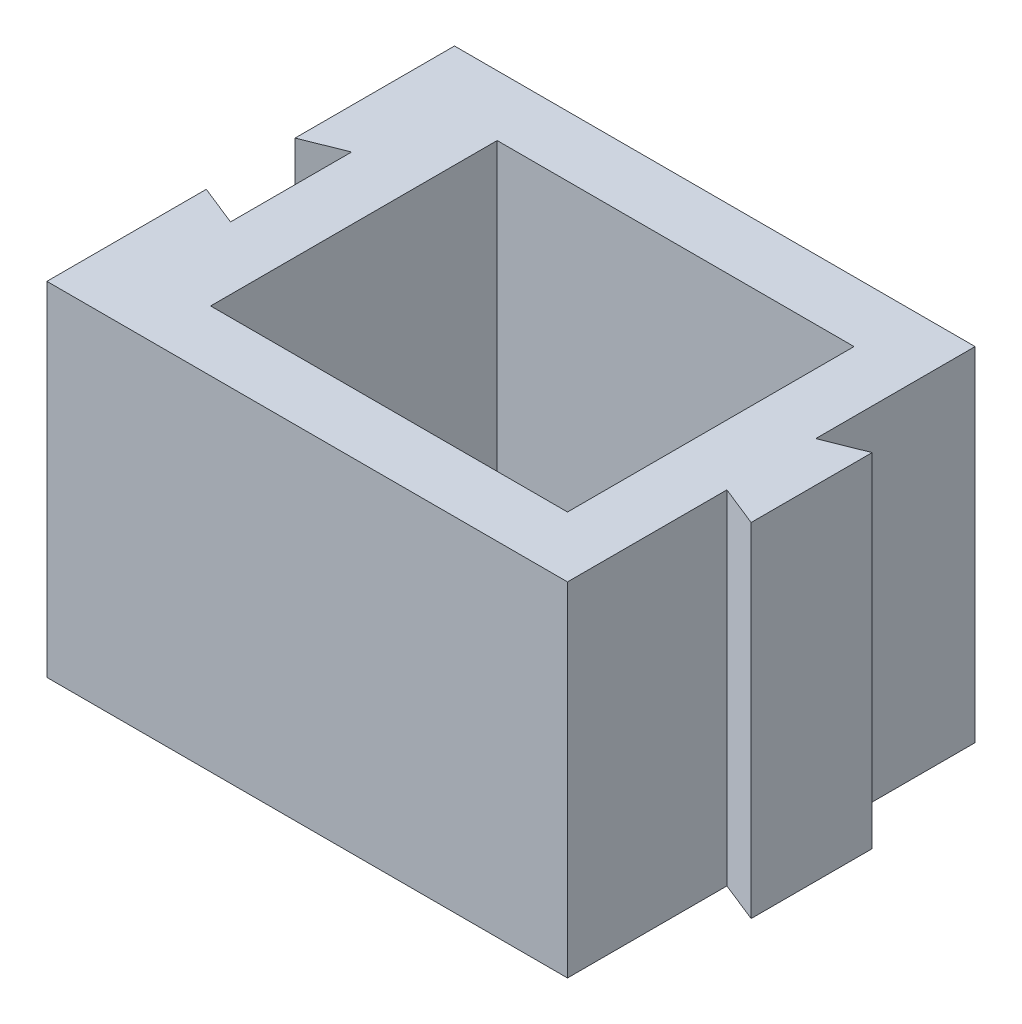
ISO-10303-21;
HEADER;
FILE_DESCRIPTION(('STEP AP214'),'2;1');
FILE_NAME('part.step','',(''),(''),'','','');
FILE_SCHEMA(('AUTOMOTIVE_DESIGN { 1 0 10303 214 1 1 1 1 }'));
ENDSEC;
DATA;
#1=APPLICATION_CONTEXT('core data for automotive mechanical design processes');
#2=APPLICATION_PROTOCOL_DEFINITION('international standard','automotive_design',2000,#1);
#3=PRODUCT_CONTEXT('',#1,'mechanical');
#4=PRODUCT('Part','Part','',(#3));
#5=PRODUCT_RELATED_PRODUCT_CATEGORY('part','',(#4));
#6=PRODUCT_DEFINITION_FORMATION('','',#4);
#7=PRODUCT_DEFINITION_CONTEXT('part definition',#1,'design');
#8=PRODUCT_DEFINITION('design','',#6,#7);
#9=PRODUCT_DEFINITION_SHAPE('','',#8);
#10=(LENGTH_UNIT() NAMED_UNIT(*) SI_UNIT(.MILLI.,.METRE.));
#11=(NAMED_UNIT(*) PLANE_ANGLE_UNIT() SI_UNIT($,.RADIAN.));
#12=(NAMED_UNIT(*) SI_UNIT($,.STERADIAN.) SOLID_ANGLE_UNIT());
#13=UNCERTAINTY_MEASURE_WITH_UNIT(LENGTH_MEASURE(1.E-05),#10,'distance_accuracy_value','');
#14=(GEOMETRIC_REPRESENTATION_CONTEXT(3) GLOBAL_UNCERTAINTY_ASSIGNED_CONTEXT((#13)) GLOBAL_UNIT_ASSIGNED_CONTEXT((#10,
#11,#12)) REPRESENTATION_CONTEXT('',''));
#15=CARTESIAN_POINT('',(0.,0.,0.));
#16=DIRECTION('',(0.,0.,1.));
#17=DIRECTION('',(1.,0.,0.));
#18=AXIS2_PLACEMENT_3D('',#15,#16,#17);
#19=CARTESIAN_POINT('',(-27.25,42.5,0.));
#20=DIRECTION('',(1.,0.,0.));
#21=DIRECTION('',(0.,0.,-1.));
#22=AXIS2_PLACEMENT_3D('',#19,#20,#21);
#23=PLANE('',#22);
#24=DIRECTION('',(0.,0.,1.));
#25=VECTOR('',#24,1.);
#26=CARTESIAN_POINT('',(-27.25,0.,0.));
#27=LINE('',#26,#25);
#28=CARTESIAN_POINT('',(-27.25,0.,-7.50000000000002));
#29=VERTEX_POINT('',#28);
#30=CARTESIAN_POINT('',(-27.25,0.,7.49999999999998));
#31=VERTEX_POINT('',#30);
#32=EDGE_CURVE('E185',#29,#31,#27,.T.);
#33=ORIENTED_EDGE('',*,*,#32,.T.);
#34=DIRECTION('',(0.,-1.,0.));
#35=VECTOR('',#34,1.);
#36=CARTESIAN_POINT('',(-27.25,42.5,7.49999999999998));
#37=LINE('',#36,#35);
#38=CARTESIAN_POINT('',(-27.25,42.5,7.49999999999998));
#39=VERTEX_POINT('',#38);
#40=EDGE_CURVE('E11',#39,#31,#37,.T.);
#41=ORIENTED_EDGE('',*,*,#40,.F.);
#42=DIRECTION('',(0.,0.,1.));
#43=VECTOR('',#42,1.);
#44=CARTESIAN_POINT('',(-27.25,42.5,0.));
#45=LINE('',#44,#43);
#46=CARTESIAN_POINT('',(-27.25,42.5,-7.50000000000002));
#47=VERTEX_POINT('',#46);
#48=EDGE_CURVE('E187',#47,#39,#45,.T.);
#49=ORIENTED_EDGE('',*,*,#48,.F.);
#50=DIRECTION('',(0.,-1.,0.));
#51=VECTOR('',#50,1.);
#52=CARTESIAN_POINT('',(-27.25,42.5,-7.50000000000002));
#53=LINE('',#52,#51);
#54=EDGE_CURVE('E216',#47,#29,#53,.T.);
#55=ORIENTED_EDGE('',*,*,#54,.T.);
#56=EDGE_LOOP('',(#33,#41,#49,#55));
#57=FACE_BOUND('',#56,.T.);
#58=ADVANCED_FACE('F43',(#57),#23,.F.);
#59=CARTESIAN_POINT('',(-6.344827586207,42.5,15.8620689655173));
#60=DIRECTION('',(-0.371390676354108,0.,0.928476690885258));
#61=DIRECTION('',(0.928476690885258,0.,0.371390676354108));
#62=AXIS2_PLACEMENT_3D('',#59,#60,#61);
#63=PLANE('',#62);
#64=DIRECTION('',(-0.928476690885258,0.,-0.371390676354108));
#65=VECTOR('',#64,1.);
#66=CARTESIAN_POINT('',(-6.344827586207,0.,15.8620689655173));
#67=LINE('',#66,#65);
#68=CARTESIAN_POINT('',(-32.25,0.,5.49999999999996));
#69=VERTEX_POINT('',#68);
#70=EDGE_CURVE('E219',#31,#69,#67,.T.);
#71=ORIENTED_EDGE('',*,*,#70,.T.);
#72=DIRECTION('',(0.,-1.,0.));
#73=VECTOR('',#72,1.);
#74=CARTESIAN_POINT('',(-32.25,42.5,5.49999999999996));
#75=LINE('',#74,#73);
#76=CARTESIAN_POINT('',(-32.25,42.5,5.49999999999996));
#77=VERTEX_POINT('',#76);
#78=EDGE_CURVE('E50',#77,#69,#75,.T.);
#79=ORIENTED_EDGE('',*,*,#78,.F.);
#80=DIRECTION('',(-0.928476690885258,0.,-0.371390676354108));
#81=VECTOR('',#80,1.);
#82=CARTESIAN_POINT('',(-6.344827586207,42.5,15.8620689655173));
#83=LINE('',#82,#81);
#84=EDGE_CURVE('E190',#39,#77,#83,.T.);
#85=ORIENTED_EDGE('',*,*,#84,.F.);
#86=ORIENTED_EDGE('',*,*,#40,.T.);
#87=EDGE_LOOP('',(#71,#79,#85,#86));
#88=FACE_BOUND('',#87,.T.);
#89=ADVANCED_FACE('F286',(#88),#63,.F.);
#90=CARTESIAN_POINT('',(-32.25,42.5,0.));
#91=DIRECTION('',(1.,0.,0.));
#92=DIRECTION('',(0.,0.,-1.));
#93=AXIS2_PLACEMENT_3D('',#90,#91,#92);
#94=PLANE('',#93);
#95=DIRECTION('',(0.,0.,1.));
#96=VECTOR('',#95,1.);
#97=CARTESIAN_POINT('',(-32.25,0.,0.));
#98=LINE('',#97,#96);
#99=CARTESIAN_POINT('',(-32.25,0.,25.25));
#100=VERTEX_POINT('',#99);
#101=EDGE_CURVE('E221',#69,#100,#98,.T.);
#102=ORIENTED_EDGE('',*,*,#101,.T.);
#103=DIRECTION('',(0.,-1.,0.));
#104=VECTOR('',#103,1.);
#105=CARTESIAN_POINT('',(-32.25,42.5,25.25));
#106=LINE('',#105,#104);
#107=CARTESIAN_POINT('',(-32.25,42.5,25.25));
#108=VERTEX_POINT('',#107);
#109=EDGE_CURVE('E263',#108,#100,#106,.T.);
#110=ORIENTED_EDGE('',*,*,#109,.F.);
#111=DIRECTION('',(0.,0.,1.));
#112=VECTOR('',#111,1.);
#113=CARTESIAN_POINT('',(-32.25,42.5,0.));
#114=LINE('',#113,#112);
#115=EDGE_CURVE('E193',#77,#108,#114,.T.);
#116=ORIENTED_EDGE('',*,*,#115,.F.);
#117=ORIENTED_EDGE('',*,*,#78,.T.);
#118=EDGE_LOOP('',(#102,#110,#116,#117));
#119=FACE_BOUND('',#118,.T.);
#120=ADVANCED_FACE('F270',(#119),#94,.F.);
#121=CARTESIAN_POINT('',(0.,42.5,25.25));
#122=DIRECTION('',(0.,0.,-1.));
#123=DIRECTION('',(-1.,0.,0.));
#124=AXIS2_PLACEMENT_3D('',#121,#122,#123);
#125=PLANE('',#124);
#126=DIRECTION('',(1.,0.,0.));
#127=VECTOR('',#126,1.);
#128=CARTESIAN_POINT('',(0.,0.,25.25));
#129=LINE('',#128,#127);
#130=CARTESIAN_POINT('',(32.25,0.,25.25));
#131=VERTEX_POINT('',#130);
#132=EDGE_CURVE('E223',#100,#131,#129,.T.);
#133=ORIENTED_EDGE('',*,*,#132,.T.);
#134=DIRECTION('',(0.,-1.,0.));
#135=VECTOR('',#134,1.);
#136=CARTESIAN_POINT('',(32.25,42.5,25.25));
#137=LINE('',#136,#135);
#138=CARTESIAN_POINT('',(32.25,42.5,25.25));
#139=VERTEX_POINT('',#138);
#140=EDGE_CURVE('E261',#139,#131,#137,.T.);
#141=ORIENTED_EDGE('',*,*,#140,.F.);
#142=DIRECTION('',(1.,0.,0.));
#143=VECTOR('',#142,1.);
#144=CARTESIAN_POINT('',(0.,42.5,25.25));
#145=LINE('',#144,#143);
#146=EDGE_CURVE('E195',#108,#139,#145,.T.);
#147=ORIENTED_EDGE('',*,*,#146,.F.);
#148=ORIENTED_EDGE('',*,*,#109,.T.);
#149=EDGE_LOOP('',(#133,#141,#147,#148));
#150=FACE_BOUND('',#149,.T.);
#151=ADVANCED_FACE('F280',(#150),#125,.F.);
#152=CARTESIAN_POINT('',(32.25,42.5,0.));
#153=DIRECTION('',(1.,0.,0.));
#154=DIRECTION('',(0.,0.,-1.));
#155=AXIS2_PLACEMENT_3D('',#152,#153,#154);
#156=PLANE('',#155);
#157=DIRECTION('',(0.,0.,1.));
#158=VECTOR('',#157,1.);
#159=CARTESIAN_POINT('',(32.25,0.,0.));
#160=LINE('',#159,#158);
#161=CARTESIAN_POINT('',(32.25,0.,5.49999999999997));
#162=VERTEX_POINT('',#161);
#163=EDGE_CURVE('E227',#162,#131,#160,.T.);
#164=ORIENTED_EDGE('',*,*,#163,.F.);
#165=DIRECTION('',(0.,-1.,0.));
#166=VECTOR('',#165,1.);
#167=CARTESIAN_POINT('',(32.25,42.5,5.49999999999997));
#168=LINE('',#167,#166);
#169=CARTESIAN_POINT('',(32.25,42.5,5.49999999999997));
#170=VERTEX_POINT('',#169);
#171=EDGE_CURVE('E259',#170,#162,#168,.T.);
#172=ORIENTED_EDGE('',*,*,#171,.F.);
#173=DIRECTION('',(0.,0.,1.));
#174=VECTOR('',#173,1.);
#175=CARTESIAN_POINT('',(32.25,42.5,0.));
#176=LINE('',#175,#174);
#177=EDGE_CURVE('E198',#170,#139,#176,.T.);
#178=ORIENTED_EDGE('',*,*,#177,.T.);
#179=ORIENTED_EDGE('',*,*,#140,.T.);
#180=EDGE_LOOP('',(#164,#172,#178,#179));
#181=FACE_BOUND('',#180,.T.);
#182=ADVANCED_FACE('F320',(#181),#156,.T.);
#183=CARTESIAN_POINT('',(2.55172413793113,42.5,-6.37931034482775));
#184=DIRECTION('',(-0.371390676354108,0.,0.928476690885258));
#185=DIRECTION('',(0.928476690885258,0.,0.371390676354108));
#186=AXIS2_PLACEMENT_3D('',#183,#184,#185);
#187=PLANE('',#186);
#188=DIRECTION('',(-0.928476690885258,0.,-0.371390676354108));
#189=VECTOR('',#188,1.);
#190=CARTESIAN_POINT('',(2.55172413793113,0.,-6.37931034482775));
#191=LINE('',#190,#189);
#192=CARTESIAN_POINT('',(37.25,0.,7.49999999999999));
#193=VERTEX_POINT('',#192);
#194=EDGE_CURVE('E230',#193,#162,#191,.T.);
#195=ORIENTED_EDGE('',*,*,#194,.F.);
#196=DIRECTION('',(0.,-1.,0.));
#197=VECTOR('',#196,1.);
#198=CARTESIAN_POINT('',(37.25,42.5,7.49999999999999));
#199=LINE('',#198,#197);
#200=CARTESIAN_POINT('',(37.25,42.5,7.49999999999999));
#201=VERTEX_POINT('',#200);
#202=EDGE_CURVE('E257',#201,#193,#199,.T.);
#203=ORIENTED_EDGE('',*,*,#202,.F.);
#204=DIRECTION('',(-0.928476690885258,0.,-0.371390676354108));
#205=VECTOR('',#204,1.);
#206=CARTESIAN_POINT('',(2.55172413793113,42.5,-6.37931034482775));
#207=LINE('',#206,#205);
#208=EDGE_CURVE('E201',#201,#170,#207,.T.);
#209=ORIENTED_EDGE('',*,*,#208,.T.);
#210=ORIENTED_EDGE('',*,*,#171,.T.);
#211=EDGE_LOOP('',(#195,#203,#209,#210));
#212=FACE_BOUND('',#211,.T.);
#213=ADVANCED_FACE('F318',(#212),#187,.T.);
#214=CARTESIAN_POINT('',(37.25,42.5,0.));
#215=DIRECTION('',(1.,0.,0.));
#216=DIRECTION('',(0.,0.,-1.));
#217=AXIS2_PLACEMENT_3D('',#214,#215,#216);
#218=PLANE('',#217);
#219=DIRECTION('',(0.,0.,1.));
#220=VECTOR('',#219,1.);
#221=CARTESIAN_POINT('',(37.25,0.,0.));
#222=LINE('',#221,#220);
#223=CARTESIAN_POINT('',(37.25,0.,-7.50000000000001));
#224=VERTEX_POINT('',#223);
#225=EDGE_CURVE('E234',#224,#193,#222,.T.);
#226=ORIENTED_EDGE('',*,*,#225,.F.);
#227=DIRECTION('',(0.,-1.,0.));
#228=VECTOR('',#227,1.);
#229=CARTESIAN_POINT('',(37.25,42.5,-7.50000000000001));
#230=LINE('',#229,#228);
#231=CARTESIAN_POINT('',(37.25,42.5,-7.50000000000001));
#232=VERTEX_POINT('',#231);
#233=EDGE_CURVE('E255',#232,#224,#230,.T.);
#234=ORIENTED_EDGE('',*,*,#233,.F.);
#235=DIRECTION('',(0.,0.,1.));
#236=VECTOR('',#235,1.);
#237=CARTESIAN_POINT('',(37.25,42.5,0.));
#238=LINE('',#237,#236);
#239=EDGE_CURVE('E205',#232,#201,#238,.T.);
#240=ORIENTED_EDGE('',*,*,#239,.T.);
#241=ORIENTED_EDGE('',*,*,#202,.T.);
#242=EDGE_LOOP('',(#226,#234,#240,#241));
#243=FACE_BOUND('',#242,.T.);
#244=ADVANCED_FACE('F315',(#243),#218,.T.);
#245=CARTESIAN_POINT('',(2.55172413793105,42.5,6.37931034482761));
#246=DIRECTION('',(-0.371390676354105,0.,-0.928476690885259));
#247=DIRECTION('',(-0.928476690885259,0.,0.371390676354105));
#248=AXIS2_PLACEMENT_3D('',#245,#246,#247);
#249=PLANE('',#248);
#250=DIRECTION('',(0.928476690885259,0.,-0.371390676354105));
#251=VECTOR('',#250,1.);
#252=CARTESIAN_POINT('',(2.55172413793105,0.,6.37931034482761));
#253=LINE('',#252,#251);
#254=CARTESIAN_POINT('',(32.25,0.,-5.50000000000001));
#255=VERTEX_POINT('',#254);
#256=EDGE_CURVE('E237',#255,#224,#253,.T.);
#257=ORIENTED_EDGE('',*,*,#256,.F.);
#258=DIRECTION('',(0.,-1.,0.));
#259=VECTOR('',#258,1.);
#260=CARTESIAN_POINT('',(32.25,42.5,-5.50000000000001));
#261=LINE('',#260,#259);
#262=CARTESIAN_POINT('',(32.25,42.5,-5.50000000000001));
#263=VERTEX_POINT('',#262);
#264=EDGE_CURVE('E253',#263,#255,#261,.T.);
#265=ORIENTED_EDGE('',*,*,#264,.F.);
#266=DIRECTION('',(0.928476690885259,0.,-0.371390676354105));
#267=VECTOR('',#266,1.);
#268=CARTESIAN_POINT('',(2.55172413793105,42.5,6.37931034482761));
#269=LINE('',#268,#267);
#270=EDGE_CURVE('E208',#263,#232,#269,.T.);
#271=ORIENTED_EDGE('',*,*,#270,.T.);
#272=ORIENTED_EDGE('',*,*,#233,.T.);
#273=EDGE_LOOP('',(#257,#265,#271,#272));
#274=FACE_BOUND('',#273,.T.);
#275=ADVANCED_FACE('F311',(#274),#249,.T.);
#276=CARTESIAN_POINT('',(32.25,0.,-25.25));
#277=VERTEX_POINT('',#276);
#278=EDGE_CURVE('E231',#277,#255,#160,.T.);
#279=ORIENTED_EDGE('',*,*,#278,.F.);
#280=DIRECTION('',(0.,-1.,0.));
#281=VECTOR('',#280,1.);
#282=CARTESIAN_POINT('',(32.25,42.5,-25.25));
#283=LINE('',#282,#281);
#284=CARTESIAN_POINT('',(32.25,42.5,-25.25));
#285=VERTEX_POINT('',#284);
#286=EDGE_CURVE('E251',#285,#277,#283,.T.);
#287=ORIENTED_EDGE('',*,*,#286,.F.);
#288=EDGE_CURVE('E202',#285,#263,#176,.T.);
#289=ORIENTED_EDGE('',*,*,#288,.T.);
#290=ORIENTED_EDGE('',*,*,#264,.T.);
#291=EDGE_LOOP('',(#279,#287,#289,#290));
#292=FACE_BOUND('',#291,.T.);
#293=ADVANCED_FACE('F306',(#292),#156,.T.);
#294=CARTESIAN_POINT('',(0.,42.5,-25.25));
#295=DIRECTION('',(0.,0.,-1.));
#296=DIRECTION('',(-1.,0.,0.));
#297=AXIS2_PLACEMENT_3D('',#294,#295,#296);
#298=PLANE('',#297);
#299=DIRECTION('',(1.,0.,0.));
#300=VECTOR('',#299,1.);
#301=CARTESIAN_POINT('',(0.,0.,-25.25));
#302=LINE('',#301,#300);
#303=CARTESIAN_POINT('',(-32.25,0.,-25.25));
#304=VERTEX_POINT('',#303);
#305=EDGE_CURVE('E240',#304,#277,#302,.T.);
#306=ORIENTED_EDGE('',*,*,#305,.F.);
#307=DIRECTION('',(0.,-1.,0.));
#308=VECTOR('',#307,1.);
#309=CARTESIAN_POINT('',(-32.25,42.5,-25.25));
#310=LINE('',#309,#308);
#311=CARTESIAN_POINT('',(-32.25,42.5,-25.25));
#312=VERTEX_POINT('',#311);
#313=EDGE_CURVE('E249',#312,#304,#310,.T.);
#314=ORIENTED_EDGE('',*,*,#313,.F.);
#315=DIRECTION('',(1.,0.,0.));
#316=VECTOR('',#315,1.);
#317=CARTESIAN_POINT('',(0.,42.5,-25.25));
#318=LINE('',#317,#316);
#319=EDGE_CURVE('E211',#312,#285,#318,.T.);
#320=ORIENTED_EDGE('',*,*,#319,.T.);
#321=ORIENTED_EDGE('',*,*,#286,.T.);
#322=EDGE_LOOP('',(#306,#314,#320,#321));
#323=FACE_BOUND('',#322,.T.);
#324=ADVANCED_FACE('F301',(#323),#298,.T.);
#325=CARTESIAN_POINT('',(-32.25,0.,-5.50000000000002));
#326=VERTEX_POINT('',#325);
#327=EDGE_CURVE('E224',#304,#326,#98,.T.);
#328=ORIENTED_EDGE('',*,*,#327,.T.);
#329=DIRECTION('',(0.,-1.,0.));
#330=VECTOR('',#329,1.);
#331=CARTESIAN_POINT('',(-32.25,42.5,-5.50000000000002));
#332=LINE('',#331,#330);
#333=CARTESIAN_POINT('',(-32.25,42.5,-5.50000000000002));
#334=VERTEX_POINT('',#333);
#335=EDGE_CURVE('E246',#334,#326,#332,.T.);
#336=ORIENTED_EDGE('',*,*,#335,.F.);
#337=EDGE_CURVE('E196',#312,#334,#114,.T.);
#338=ORIENTED_EDGE('',*,*,#337,.F.);
#339=ORIENTED_EDGE('',*,*,#313,.T.);
#340=EDGE_LOOP('',(#328,#336,#338,#339));
#341=FACE_BOUND('',#340,.T.);
#342=ADVANCED_FACE('F298',(#341),#94,.F.);
#343=CARTESIAN_POINT('',(-6.34482758620693,42.5,-15.8620689655173));
#344=DIRECTION('',(-0.371390676354105,0.,-0.928476690885259));
#345=DIRECTION('',(-0.928476690885259,0.,0.371390676354105));
#346=AXIS2_PLACEMENT_3D('',#343,#344,#345);
#347=PLANE('',#346);
#348=DIRECTION('',(0.928476690885259,0.,-0.371390676354105));
#349=VECTOR('',#348,1.);
#350=CARTESIAN_POINT('',(-6.34482758620693,0.,-15.8620689655173));
#351=LINE('',#350,#349);
#352=EDGE_CURVE('E191',#326,#29,#351,.T.);
#353=ORIENTED_EDGE('',*,*,#352,.T.);
#354=ORIENTED_EDGE('',*,*,#54,.F.);
#355=DIRECTION('',(0.928476690885259,0.,-0.371390676354105));
#356=VECTOR('',#355,1.);
#357=CARTESIAN_POINT('',(-6.34482758620693,42.5,-15.8620689655173));
#358=LINE('',#357,#356);
#359=EDGE_CURVE('E214',#334,#47,#358,.T.);
#360=ORIENTED_EDGE('',*,*,#359,.F.);
#361=ORIENTED_EDGE('',*,*,#335,.T.);
#362=EDGE_LOOP('',(#353,#354,#360,#361));
#363=FACE_BOUND('',#362,.T.);
#364=ADVANCED_FACE('F293',(#363),#347,.F.);
#365=CARTESIAN_POINT('',(0.,42.5,0.));
#366=DIRECTION('',(0.,1.,0.));
#367=DIRECTION('',(0.,0.,1.));
#368=AXIS2_PLACEMENT_3D('',#365,#366,#367);
#369=PLANE('',#368);
#370=DIRECTION('',(1.,0.,0.));
#371=VECTOR('',#370,1.);
#372=CARTESIAN_POINT('',(24.75,42.5,17.75));
#373=LINE('',#372,#371);
#374=CARTESIAN_POINT('',(-19.4647021136519,42.5,17.75));
#375=VERTEX_POINT('',#374);
#376=CARTESIAN_POINT('',(24.75,42.5,17.75));
#377=VERTEX_POINT('',#376);
#378=EDGE_CURVE('E57',#375,#377,#373,.T.);
#379=ORIENTED_EDGE('',*,*,#378,.F.);
#380=DIRECTION('',(0.,0.,1.));
#381=VECTOR('',#380,1.);
#382=CARTESIAN_POINT('',(-19.4647021136519,42.5,17.75));
#383=LINE('',#382,#381);
#384=CARTESIAN_POINT('',(-19.4647021136519,42.5,-17.75));
#385=VERTEX_POINT('',#384);
#386=EDGE_CURVE('E174',#385,#375,#383,.T.);
#387=ORIENTED_EDGE('',*,*,#386,.F.);
#388=DIRECTION('',(-1.,0.,0.));
#389=VECTOR('',#388,1.);
#390=CARTESIAN_POINT('',(-19.4647021136519,42.5,-17.75));
#391=LINE('',#390,#389);
#392=CARTESIAN_POINT('',(24.75,42.5,-17.75));
#393=VERTEX_POINT('',#392);
#394=EDGE_CURVE('E158',#393,#385,#391,.T.);
#395=ORIENTED_EDGE('',*,*,#394,.F.);
#396=DIRECTION('',(0.,0.,-1.));
#397=VECTOR('',#396,1.);
#398=CARTESIAN_POINT('',(24.75,42.5,-17.75));
#399=LINE('',#398,#397);
#400=EDGE_CURVE('E167',#377,#393,#399,.T.);
#401=ORIENTED_EDGE('',*,*,#400,.F.);
#402=EDGE_LOOP('',(#379,#387,#395,#401));
#403=FACE_BOUND('',#402,.T.);
#404=ORIENTED_EDGE('',*,*,#48,.T.);
#405=ORIENTED_EDGE('',*,*,#84,.T.);
#406=ORIENTED_EDGE('',*,*,#115,.T.);
#407=ORIENTED_EDGE('',*,*,#146,.T.);
#408=ORIENTED_EDGE('',*,*,#177,.F.);
#409=ORIENTED_EDGE('',*,*,#208,.F.);
#410=ORIENTED_EDGE('',*,*,#239,.F.);
#411=ORIENTED_EDGE('',*,*,#270,.F.);
#412=ORIENTED_EDGE('',*,*,#288,.F.);
#413=ORIENTED_EDGE('',*,*,#319,.F.);
#414=ORIENTED_EDGE('',*,*,#337,.T.);
#415=ORIENTED_EDGE('',*,*,#359,.T.);
#416=EDGE_LOOP('',(#404,#405,#406,#407,#408,#409,#410,#411,#412,#413,#414,#415));
#417=FACE_BOUND('',#416,.T.);
#418=ADVANCED_FACE('F171',(#403,#417),#369,.T.);
#419=CARTESIAN_POINT('',(0.,0.,0.));
#420=DIRECTION('',(0.,1.,0.));
#421=DIRECTION('',(0.,0.,1.));
#422=AXIS2_PLACEMENT_3D('',#419,#420,#421);
#423=PLANE('',#422);
#424=DIRECTION('',(0.,0.,-1.));
#425=VECTOR('',#424,1.);
#426=CARTESIAN_POINT('',(-19.4647021136519,0.,17.75));
#427=LINE('',#426,#425);
#428=CARTESIAN_POINT('',(-19.4647021136519,0.,17.75));
#429=VERTEX_POINT('',#428);
#430=CARTESIAN_POINT('',(-19.4647021136519,0.,-17.75));
#431=VERTEX_POINT('',#430);
#432=EDGE_CURVE('E479',#429,#431,#427,.T.);
#433=ORIENTED_EDGE('',*,*,#432,.F.);
#434=DIRECTION('',(-1.,0.,0.));
#435=VECTOR('',#434,1.);
#436=CARTESIAN_POINT('',(24.75,0.,17.75));
#437=LINE('',#436,#435);
#438=CARTESIAN_POINT('',(24.75,0.,17.75));
#439=VERTEX_POINT('',#438);
#440=EDGE_CURVE('E186',#439,#429,#437,.T.);
#441=ORIENTED_EDGE('',*,*,#440,.F.);
#442=DIRECTION('',(0.,0.,1.));
#443=VECTOR('',#442,1.);
#444=CARTESIAN_POINT('',(24.75,0.,-17.75));
#445=LINE('',#444,#443);
#446=CARTESIAN_POINT('',(24.75,0.,-17.75));
#447=VERTEX_POINT('',#446);
#448=EDGE_CURVE('E183',#447,#439,#445,.T.);
#449=ORIENTED_EDGE('',*,*,#448,.F.);
#450=DIRECTION('',(1.,0.,0.));
#451=VECTOR('',#450,1.);
#452=CARTESIAN_POINT('',(-19.4647021136519,0.,-17.75));
#453=LINE('',#452,#451);
#454=EDGE_CURVE('E161',#431,#447,#453,.T.);
#455=ORIENTED_EDGE('',*,*,#454,.F.);
#456=EDGE_LOOP('',(#433,#441,#449,#455));
#457=FACE_BOUND('',#456,.T.);
#458=ORIENTED_EDGE('',*,*,#32,.F.);
#459=ORIENTED_EDGE('',*,*,#352,.F.);
#460=ORIENTED_EDGE('',*,*,#327,.F.);
#461=ORIENTED_EDGE('',*,*,#305,.T.);
#462=ORIENTED_EDGE('',*,*,#278,.T.);
#463=ORIENTED_EDGE('',*,*,#256,.T.);
#464=ORIENTED_EDGE('',*,*,#225,.T.);
#465=ORIENTED_EDGE('',*,*,#194,.T.);
#466=ORIENTED_EDGE('',*,*,#163,.T.);
#467=ORIENTED_EDGE('',*,*,#132,.F.);
#468=ORIENTED_EDGE('',*,*,#101,.F.);
#469=ORIENTED_EDGE('',*,*,#70,.F.);
#470=EDGE_LOOP('',(#458,#459,#460,#461,#462,#463,#464,#465,#466,#467,#468,#469));
#471=FACE_BOUND('',#470,.T.);
#472=ADVANCED_FACE('F276',(#457,#471),#423,.F.);
#473=CARTESIAN_POINT('',(24.75,-56.7026444092247,17.75));
#474=DIRECTION('',(0.,0.,1.));
#475=DIRECTION('',(1.,0.,0.));
#476=AXIS2_PLACEMENT_3D('',#473,#474,#475);
#477=PLANE('',#476);
#478=ORIENTED_EDGE('',*,*,#440,.T.);
#479=DIRECTION('',(0.,1.,0.));
#480=VECTOR('',#479,1.);
#481=CARTESIAN_POINT('',(-19.4647021136519,-56.7026444092247,17.75));
#482=LINE('',#481,#480);
#483=EDGE_CURVE('E179',#429,#375,#482,.T.);
#484=ORIENTED_EDGE('',*,*,#483,.T.);
#485=ORIENTED_EDGE('',*,*,#378,.T.);
#486=DIRECTION('',(0.,1.,0.));
#487=VECTOR('',#486,1.);
#488=CARTESIAN_POINT('',(24.75,-56.7026444092247,17.75));
#489=LINE('',#488,#487);
#490=EDGE_CURVE('E164',#439,#377,#489,.T.);
#491=ORIENTED_EDGE('',*,*,#490,.F.);
#492=EDGE_LOOP('',(#478,#484,#485,#491));
#493=FACE_BOUND('',#492,.T.);
#494=ADVANCED_FACE('F386',(#493),#477,.F.);
#495=CARTESIAN_POINT('',(-19.4647021136519,-56.7026444092247,17.75));
#496=DIRECTION('',(-1.,0.,0.));
#497=DIRECTION('',(0.,0.,1.));
#498=AXIS2_PLACEMENT_3D('',#495,#496,#497);
#499=PLANE('',#498);
#500=ORIENTED_EDGE('',*,*,#432,.T.);
#501=DIRECTION('',(0.,1.,0.));
#502=VECTOR('',#501,1.);
#503=CARTESIAN_POINT('',(-19.4647021136519,-56.7026444092247,-17.75));
#504=LINE('',#503,#502);
#505=EDGE_CURVE('E163',#431,#385,#504,.T.);
#506=ORIENTED_EDGE('',*,*,#505,.T.);
#507=ORIENTED_EDGE('',*,*,#386,.T.);
#508=ORIENTED_EDGE('',*,*,#483,.F.);
#509=EDGE_LOOP('',(#500,#506,#507,#508));
#510=FACE_BOUND('',#509,.T.);
#511=ADVANCED_FACE('F394',(#510),#499,.F.);
#512=CARTESIAN_POINT('',(-19.4647021136519,-56.7026444092247,-17.75));
#513=DIRECTION('',(0.,0.,-1.));
#514=DIRECTION('',(-1.,0.,0.));
#515=AXIS2_PLACEMENT_3D('',#512,#513,#514);
#516=PLANE('',#515);
#517=ORIENTED_EDGE('',*,*,#454,.T.);
#518=DIRECTION('',(0.,1.,0.));
#519=VECTOR('',#518,1.);
#520=CARTESIAN_POINT('',(24.75,-56.7026444092247,-17.75));
#521=LINE('',#520,#519);
#522=EDGE_CURVE('E65',#447,#393,#521,.T.);
#523=ORIENTED_EDGE('',*,*,#522,.T.);
#524=ORIENTED_EDGE('',*,*,#394,.T.);
#525=ORIENTED_EDGE('',*,*,#505,.F.);
#526=EDGE_LOOP('',(#517,#523,#524,#525));
#527=FACE_BOUND('',#526,.T.);
#528=ADVANCED_FACE('F155',(#527),#516,.F.);
#529=CARTESIAN_POINT('',(24.75,-56.7026444092247,-17.75));
#530=DIRECTION('',(1.,0.,0.));
#531=DIRECTION('',(0.,0.,-1.));
#532=AXIS2_PLACEMENT_3D('',#529,#530,#531);
#533=PLANE('',#532);
#534=ORIENTED_EDGE('',*,*,#448,.T.);
#535=ORIENTED_EDGE('',*,*,#490,.T.);
#536=ORIENTED_EDGE('',*,*,#400,.T.);
#537=ORIENTED_EDGE('',*,*,#522,.F.);
#538=EDGE_LOOP('',(#534,#535,#536,#537));
#539=FACE_BOUND('',#538,.T.);
#540=ADVANCED_FACE('F168',(#539),#533,.F.);
#541=CLOSED_SHELL('',(#58,#89,#120,#151,#182,#213,#244,#275,#293,#324,#342,#364,#418,#472,#494,
#511,#528,#540));
#542=MANIFOLD_SOLID_BREP('B2',#541);
#543=ADVANCED_BREP_SHAPE_REPRESENTATION('',(#18,#542),#14);
#544=SHAPE_DEFINITION_REPRESENTATION(#9,#543);
ENDSEC;
END-ISO-10303-21;
